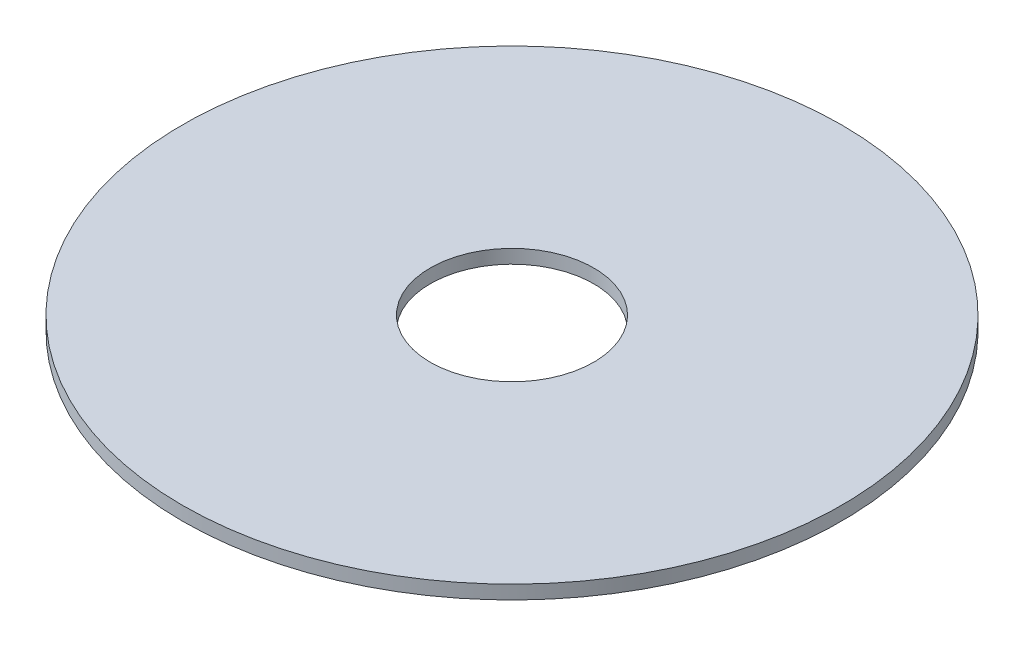
ISO-10303-21;
HEADER;
FILE_DESCRIPTION(('STEP AP214'),'2;1');
FILE_NAME('part.step','',(''),(''),'','','');
FILE_SCHEMA(('AUTOMOTIVE_DESIGN { 1 0 10303 214 1 1 1 1 }'));
ENDSEC;
DATA;
#1=APPLICATION_CONTEXT('core data for automotive mechanical design processes');
#2=APPLICATION_PROTOCOL_DEFINITION('international standard','automotive_design',2000,#1);
#3=PRODUCT_CONTEXT('',#1,'mechanical');
#4=PRODUCT('Part','Part','',(#3));
#5=PRODUCT_RELATED_PRODUCT_CATEGORY('part','',(#4));
#6=PRODUCT_DEFINITION_FORMATION('','',#4);
#7=PRODUCT_DEFINITION_CONTEXT('part definition',#1,'design');
#8=PRODUCT_DEFINITION('design','',#6,#7);
#9=PRODUCT_DEFINITION_SHAPE('','',#8);
#10=(LENGTH_UNIT() NAMED_UNIT(*) SI_UNIT(.MILLI.,.METRE.));
#11=(NAMED_UNIT(*) PLANE_ANGLE_UNIT() SI_UNIT($,.RADIAN.));
#12=(NAMED_UNIT(*) SI_UNIT($,.STERADIAN.) SOLID_ANGLE_UNIT());
#13=UNCERTAINTY_MEASURE_WITH_UNIT(LENGTH_MEASURE(1.E-05),#10,'distance_accuracy_value','');
#14=(GEOMETRIC_REPRESENTATION_CONTEXT(3) GLOBAL_UNCERTAINTY_ASSIGNED_CONTEXT((#13)) GLOBAL_UNIT_ASSIGNED_CONTEXT((#10,
#11,#12)) REPRESENTATION_CONTEXT('',''));
#15=CARTESIAN_POINT('',(0.,0.,0.));
#16=DIRECTION('',(0.,0.,1.));
#17=DIRECTION('',(1.,0.,0.));
#18=AXIS2_PLACEMENT_3D('',#15,#16,#17);
#19=CARTESIAN_POINT('',(0.,1.5875,0.));
#20=DIRECTION('',(0.,1.,0.));
#21=DIRECTION('',(0.,0.,1.));
#22=AXIS2_PLACEMENT_3D('',#19,#20,#21);
#23=PLANE('',#22);
#24=CARTESIAN_POINT('',(0.,1.5875,0.));
#25=DIRECTION('',(0.,1.,0.));
#26=DIRECTION('',(0.,0.,1.));
#27=AXIS2_PLACEMENT_3D('',#24,#25,#26);
#28=CIRCLE('',#27,38.1);
#29=CARTESIAN_POINT('',(0.,1.5875,38.1));
#30=VERTEX_POINT('',#29);
#31=EDGE_CURVE('E10',#30,#30,#28,.T.);
#32=ORIENTED_EDGE('',*,*,#31,.T.);
#33=EDGE_LOOP('',(#32));
#34=FACE_BOUND('',#33,.T.);
#35=CARTESIAN_POINT('',(0.,1.5875,0.));
#36=DIRECTION('',(0.,1.,0.));
#37=DIRECTION('',(0.,0.,1.));
#38=AXIS2_PLACEMENT_3D('',#35,#36,#37);
#39=CIRCLE('',#38,9.4488);
#40=CARTESIAN_POINT('',(0.,1.5875,9.4488));
#41=VERTEX_POINT('',#40);
#42=EDGE_CURVE('E44',#41,#41,#39,.T.);
#43=ORIENTED_EDGE('',*,*,#42,.F.);
#44=EDGE_LOOP('',(#43));
#45=FACE_BOUND('',#44,.T.);
#46=ADVANCED_FACE('F33',(#34,#45),#23,.T.);
#47=CARTESIAN_POINT('',(0.,0.,0.));
#48=DIRECTION('',(0.,1.,0.));
#49=DIRECTION('',(0.,0.,1.));
#50=AXIS2_PLACEMENT_3D('',#47,#48,#49);
#51=PLANE('',#50);
#52=CARTESIAN_POINT('',(0.,0.,0.));
#53=DIRECTION('',(0.,1.,0.));
#54=DIRECTION('',(0.,0.,1.));
#55=AXIS2_PLACEMENT_3D('',#52,#53,#54);
#56=CIRCLE('',#55,38.1);
#57=CARTESIAN_POINT('',(0.,0.,38.1));
#58=VERTEX_POINT('',#57);
#59=EDGE_CURVE('E37',#58,#58,#56,.T.);
#60=ORIENTED_EDGE('',*,*,#59,.F.);
#61=EDGE_LOOP('',(#60));
#62=FACE_BOUND('',#61,.T.);
#63=CARTESIAN_POINT('',(0.,0.,0.));
#64=DIRECTION('',(0.,1.,0.));
#65=DIRECTION('',(0.,0.,1.));
#66=AXIS2_PLACEMENT_3D('',#63,#64,#65);
#67=CIRCLE('',#66,9.4488);
#68=CARTESIAN_POINT('',(0.,0.,9.4488));
#69=VERTEX_POINT('',#68);
#70=EDGE_CURVE('E46',#69,#69,#67,.T.);
#71=ORIENTED_EDGE('',*,*,#70,.T.);
#72=EDGE_LOOP('',(#71));
#73=FACE_BOUND('',#72,.T.);
#74=ADVANCED_FACE('F56',(#62,#73),#51,.F.);
#75=CARTESIAN_POINT('',(0.,1.5875,0.));
#76=DIRECTION('',(0.,-1.,0.));
#77=DIRECTION('',(0.,0.,-1.));
#78=AXIS2_PLACEMENT_3D('',#75,#76,#77);
#79=CYLINDRICAL_SURFACE('',#78,38.1);
#80=ORIENTED_EDGE('',*,*,#31,.F.);
#81=EDGE_LOOP('',(#80));
#82=FACE_BOUND('',#81,.T.);
#83=ORIENTED_EDGE('',*,*,#59,.T.);
#84=EDGE_LOOP('',(#83));
#85=FACE_BOUND('',#84,.T.);
#86=ADVANCED_FACE('F35',(#82,#85),#79,.T.);
#87=CARTESIAN_POINT('',(0.,1.5875,0.));
#88=DIRECTION('',(0.,-1.,0.));
#89=DIRECTION('',(0.,0.,-1.));
#90=AXIS2_PLACEMENT_3D('',#87,#88,#89);
#91=CYLINDRICAL_SURFACE('',#90,9.4488);
#92=ORIENTED_EDGE('',*,*,#42,.T.);
#93=EDGE_LOOP('',(#92));
#94=FACE_BOUND('',#93,.T.);
#95=ORIENTED_EDGE('',*,*,#70,.F.);
#96=EDGE_LOOP('',(#95));
#97=FACE_BOUND('',#96,.T.);
#98=ADVANCED_FACE('F52',(#94,#97),#91,.F.);
#99=CLOSED_SHELL('',(#46,#74,#86,#98));
#100=MANIFOLD_SOLID_BREP('B2',#99);
#101=ADVANCED_BREP_SHAPE_REPRESENTATION('',(#18,#100),#14);
#102=SHAPE_DEFINITION_REPRESENTATION(#9,#101);
ENDSEC;
END-ISO-10303-21;
